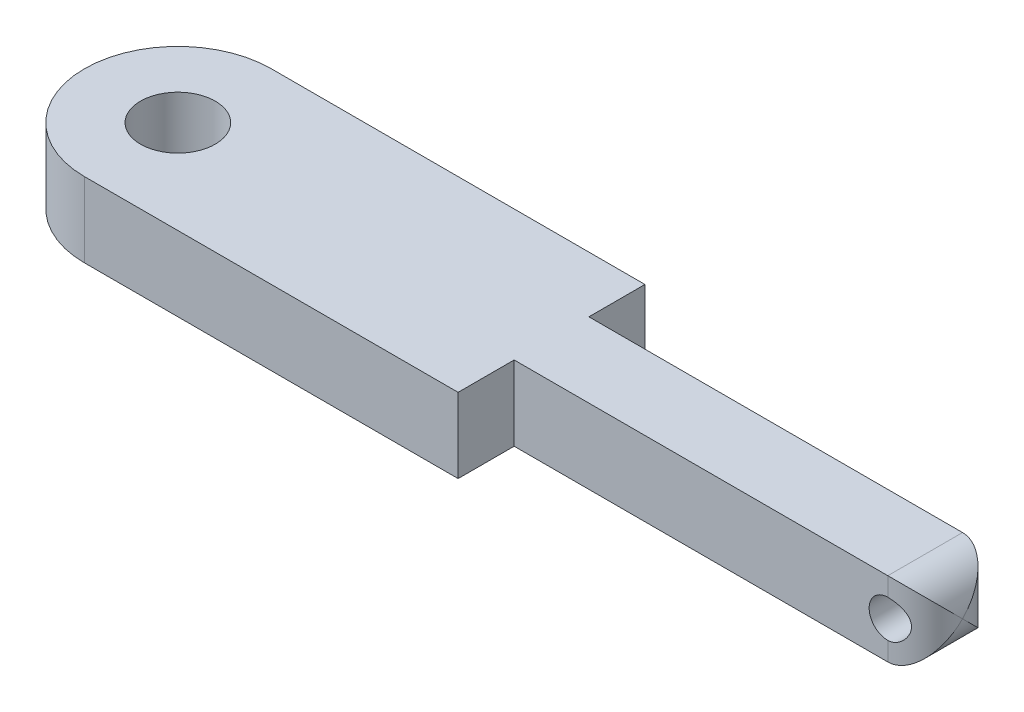
ISO-10303-21;
HEADER;
FILE_DESCRIPTION(('STEP AP214'),'2;1');
FILE_NAME('part.step','',(''),(''),'','','');
FILE_SCHEMA(('AUTOMOTIVE_DESIGN { 1 0 10303 214 1 1 1 1 }'));
ENDSEC;
DATA;
#1=APPLICATION_CONTEXT('core data for automotive mechanical design processes');
#2=APPLICATION_PROTOCOL_DEFINITION('international standard','automotive_design',2000,#1);
#3=PRODUCT_CONTEXT('',#1,'mechanical');
#4=PRODUCT('Part','Part','',(#3));
#5=PRODUCT_RELATED_PRODUCT_CATEGORY('part','',(#4));
#6=PRODUCT_DEFINITION_FORMATION('','',#4);
#7=PRODUCT_DEFINITION_CONTEXT('part definition',#1,'design');
#8=PRODUCT_DEFINITION('design','',#6,#7);
#9=PRODUCT_DEFINITION_SHAPE('','',#8);
#10=(LENGTH_UNIT() NAMED_UNIT(*) SI_UNIT(.MILLI.,.METRE.));
#11=(NAMED_UNIT(*) PLANE_ANGLE_UNIT() SI_UNIT($,.RADIAN.));
#12=(NAMED_UNIT(*) SI_UNIT($,.STERADIAN.) SOLID_ANGLE_UNIT());
#13=UNCERTAINTY_MEASURE_WITH_UNIT(LENGTH_MEASURE(1.E-05),#10,'distance_accuracy_value','');
#14=(GEOMETRIC_REPRESENTATION_CONTEXT(3) GLOBAL_UNCERTAINTY_ASSIGNED_CONTEXT((#13)) GLOBAL_UNIT_ASSIGNED_CONTEXT((#10,
#11,#12)) REPRESENTATION_CONTEXT('',''));
#15=CARTESIAN_POINT('',(0.,0.,0.));
#16=DIRECTION('',(0.,0.,1.));
#17=DIRECTION('',(1.,0.,0.));
#18=AXIS2_PLACEMENT_3D('',#15,#16,#17);
#19=CARTESIAN_POINT('',(10.,0.,0.));
#20=DIRECTION('',(0.,1.,0.));
#21=DIRECTION('',(0.,0.,1.));
#22=AXIS2_PLACEMENT_3D('',#19,#20,#21);
#23=CYLINDRICAL_SURFACE('',#22,1.);
#24=DIRECTION('',(0.,1.,0.));
#25=VECTOR('',#24,1.);
#26=CARTESIAN_POINT('',(10.,0.,-1.));
#27=LINE('',#26,#25);
#28=CARTESIAN_POINT('',(10.,0.,-1.));
#29=VERTEX_POINT('',#28);
#30=CARTESIAN_POINT('',(10.,0.499999999999999,-1.));
#31=VERTEX_POINT('',#30);
#32=EDGE_CURVE('E137',#29,#31,#27,.T.);
#33=ORIENTED_EDGE('',*,*,#32,.T.);
#34=CARTESIAN_POINT('',(10.,0.499999999999999,-1.));
#35=CARTESIAN_POINT('',(10.0264109436122,0.499969278646028,-1.00003489347554));
#36=CARTESIAN_POINT('',(10.052786216714,0.502090198402809,-0.998955179933705));
#37=CARTESIAN_POINT('',(10.1046170590602,0.510375344678821,-0.994841298896768));
#38=CARTESIAN_POINT('',(10.1300763145599,0.516520844722159,-0.99181618457059));
#39=CARTESIAN_POINT('',(10.1794560065244,0.532590236268932,-0.984086072426958));
#40=CARTESIAN_POINT('',(10.2033781664755,0.542509806479023,-0.979382996250282));
#41=CARTESIAN_POINT('',(10.2492118588335,0.565771476653636,-0.968734626101912));
#42=CARTESIAN_POINT('',(10.2711213519603,0.579116997047639,-0.962788091782536));
#43=CARTESIAN_POINT('',(10.3137552767197,0.609759273924516,-0.949781142113348));
#44=CARTESIAN_POINT('',(10.3343298069632,0.627245013574984,-0.942675309454626));
#45=CARTESIAN_POINT('',(10.3723914797384,0.665262920256701,-0.92829904239433));
#46=CARTESIAN_POINT('',(10.3898765929843,0.685797073467811,-0.921028503315962));
#47=CARTESIAN_POINT('',(10.4226262191922,0.731241940379166,-0.906494682588945));
#48=CARTESIAN_POINT('',(10.4376130301563,0.756368645666281,-0.899275766793425));
#49=CARTESIAN_POINT('',(10.4630843600092,0.809184333831799,-0.886429754665851));
#50=CARTESIAN_POINT('',(10.4735722016973,0.836871407265734,-0.880801484583976));
#51=CARTESIAN_POINT('',(10.4890661368589,0.892332245864772,-0.872289383056603));
#52=CARTESIAN_POINT('',(10.4943628088972,0.920001595609081,-0.869261426378289));
#53=CARTESIAN_POINT('',(10.5002134829302,0.975988774463041,-0.865909457745175));
#54=CARTESIAN_POINT('',(10.5007720644617,1.00430595086791,-0.865582834860694));
#55=CARTESIAN_POINT('',(10.4973436265784,1.05714328052156,-0.86755466123951));
#56=CARTESIAN_POINT('',(10.4938922056216,1.08171254841555,-0.869543861679792));
#57=CARTESIAN_POINT('',(10.4834697725099,1.12986146662372,-0.875381226954478));
#58=CARTESIAN_POINT('',(10.4764977152904,1.15344082083986,-0.879229943752459));
#59=CARTESIAN_POINT('',(10.4591050153264,1.19961424269755,-0.888437317432712));
#60=CARTESIAN_POINT('',(10.4486078372095,1.22217257325342,-0.89382905302402));
#61=CARTESIAN_POINT('',(10.4245212064231,1.2653165791887,-0.905516848396164));
#62=CARTESIAN_POINT('',(10.4109302797226,1.28590130757024,-0.911813338722587));
#63=CARTESIAN_POINT('',(10.3790336032019,1.32725994248255,-0.925565560593102));
#64=CARTESIAN_POINT('',(10.3603485996033,1.34772713862001,-0.933067070737564));
#65=CARTESIAN_POINT('',(10.3197789256663,1.38536668184063,-0.947737690917046));
#66=CARTESIAN_POINT('',(10.2978925389202,1.40253724995868,-0.954906619907227));
#67=CARTESIAN_POINT('',(10.2502467630778,1.43385080540682,-0.968513390794041));
#68=CARTESIAN_POINT('',(10.2243538078332,1.44781386783331,-0.974901126588278));
#69=CARTESIAN_POINT('',(10.1702010284742,1.47105853510722,-0.985794285525002));
#70=CARTESIAN_POINT('',(10.1419455672184,1.48034855635226,-0.990303090191398));
#71=CARTESIAN_POINT('',(10.0945508034102,1.49134368741379,-0.99569316261751));
#72=CARTESIAN_POINT('',(10.0758359223299,1.49457874017518,-0.99729742407765));
#73=CARTESIAN_POINT('',(10.0380862304126,1.49891094061456,-0.999455377378267));
#74=CARTESIAN_POINT('',(10.0190511723547,1.50000635182835,-1.00000821590818));
#75=CARTESIAN_POINT('',(10.,1.5,-1.));
#76=B_SPLINE_CURVE_WITH_KNOTS('',3,(#34,#35,#36,#37,#38,#39,#40,#41,#42,#43,#44,#45,#46,#47,#48,
#49,#50,#51,#52,#53,#54,#55,#56,#57,#58,#59,#60,#61,#62,#63,#64,#65,#66,#67,#68,#69,#70,#71,#72,
#73,#74,#75),.UNSPECIFIED.,.F.,.F.,(4,2,2,2,2,2,2,2,2,2,2,2,2,2,2,2,2,2,2,2,4),(0.,
0.0790696798558918,0.157774035821077,0.236388545538948,0.315081850421875,0.39849517559633,
0.481963088819586,0.571909672670744,0.661789709902211,0.746289073897586,0.830706756868567,
0.905029335830032,0.979373989662274,1.05545012161112,1.13156257654031,1.21732203515647,
1.30312764301931,1.39296054548354,1.48263106952233,1.53966960678405,1.59675441548445),.UNSPECIFIED.);
#77=CARTESIAN_POINT('',(10.,1.5,-1.));
#78=VERTEX_POINT('',#77);
#79=EDGE_CURVE('E63',#31,#78,#76,.T.);
#80=ORIENTED_EDGE('',*,*,#79,.T.);
#81=CARTESIAN_POINT('',(10.,2.,-1.));
#82=VERTEX_POINT('',#81);
#83=EDGE_CURVE('E134',#78,#82,#27,.T.);
#84=ORIENTED_EDGE('',*,*,#83,.T.);
#85=CARTESIAN_POINT('',(10.,1.,0.));
#86=DIRECTION('',(0.,0.707106781186547,0.707106781186548));
#87=DIRECTION('',(0.,0.707106781186548,-0.707106781186547));
#88=AXIS2_PLACEMENT_3D('',#85,#86,#87);
#89=ELLIPSE('',#88,1.4142135623731,1.);
#90=CARTESIAN_POINT('',(11.,1.,0.));
#91=VERTEX_POINT('',#90);
#92=EDGE_CURVE('E204',#82,#91,#89,.F.);
#93=ORIENTED_EDGE('',*,*,#92,.T.);
#94=CARTESIAN_POINT('',(10.,1.,0.));
#95=DIRECTION('',(0.,0.707106781186548,-0.707106781186547));
#96=DIRECTION('',(0.,0.707106781186547,0.707106781186548));
#97=AXIS2_PLACEMENT_3D('',#94,#95,#96);
#98=ELLIPSE('',#97,1.41421356237309,1.);
#99=EDGE_CURVE('E209',#91,#29,#98,.T.);
#100=ORIENTED_EDGE('',*,*,#99,.T.);
#101=EDGE_LOOP('',(#33,#80,#84,#93,#100));
#102=FACE_BOUND('',#101,.T.);
#103=ADVANCED_FACE('F43',(#102),#23,.T.);
#104=CARTESIAN_POINT('',(0.,2.,-2.5));
#105=DIRECTION('',(-1.,0.,0.));
#106=DIRECTION('',(0.,0.,1.));
#107=AXIS2_PLACEMENT_3D('',#104,#105,#106);
#108=PLANE('',#107);
#109=DIRECTION('',(0.,1.,0.));
#110=VECTOR('',#109,1.);
#111=CARTESIAN_POINT('',(0.,2.,-1.));
#112=LINE('',#111,#110);
#113=CARTESIAN_POINT('',(0.,0.,-1.));
#114=VERTEX_POINT('',#113);
#115=CARTESIAN_POINT('',(0.,2.,-1.));
#116=VERTEX_POINT('',#115);
#117=EDGE_CURVE('E146',#114,#116,#112,.T.);
#118=ORIENTED_EDGE('',*,*,#117,.F.);
#119=DIRECTION('',(0.,0.,-1.));
#120=VECTOR('',#119,1.);
#121=CARTESIAN_POINT('',(0.,0.,-2.5));
#122=LINE('',#121,#120);
#123=CARTESIAN_POINT('',(0.,0.,-2.5));
#124=VERTEX_POINT('',#123);
#125=EDGE_CURVE('E188',#114,#124,#122,.T.);
#126=ORIENTED_EDGE('',*,*,#125,.T.);
#127=DIRECTION('',(0.,-1.,0.));
#128=VECTOR('',#127,1.);
#129=CARTESIAN_POINT('',(0.,2.,-2.5));
#130=LINE('',#129,#128);
#131=CARTESIAN_POINT('',(0.,2.,-2.5));
#132=VERTEX_POINT('',#131);
#133=EDGE_CURVE('E195',#132,#124,#130,.T.);
#134=ORIENTED_EDGE('',*,*,#133,.F.);
#135=DIRECTION('',(0.,0.,-1.));
#136=VECTOR('',#135,1.);
#137=CARTESIAN_POINT('',(0.,2.,-2.5));
#138=LINE('',#137,#136);
#139=EDGE_CURVE('E177',#116,#132,#138,.T.);
#140=ORIENTED_EDGE('',*,*,#139,.F.);
#141=EDGE_LOOP('',(#118,#126,#134,#140));
#142=FACE_BOUND('',#141,.T.);
#143=ADVANCED_FACE('F249',(#142),#108,.F.);
#144=DIRECTION('',(0.,-1.,0.));
#145=VECTOR('',#144,1.);
#146=CARTESIAN_POINT('',(0.,2.,1.));
#147=LINE('',#146,#145);
#148=CARTESIAN_POINT('',(0.,2.,1.));
#149=VERTEX_POINT('',#148);
#150=CARTESIAN_POINT('',(0.,0.,1.));
#151=VERTEX_POINT('',#150);
#152=EDGE_CURVE('E154',#149,#151,#147,.T.);
#153=ORIENTED_EDGE('',*,*,#152,.F.);
#154=CARTESIAN_POINT('',(0.,2.,2.5));
#155=VERTEX_POINT('',#154);
#156=EDGE_CURVE('E178',#155,#149,#138,.T.);
#157=ORIENTED_EDGE('',*,*,#156,.F.);
#158=DIRECTION('',(0.,-1.,0.));
#159=VECTOR('',#158,1.);
#160=CARTESIAN_POINT('',(0.,2.,2.5));
#161=LINE('',#160,#159);
#162=CARTESIAN_POINT('',(0.,0.,2.5));
#163=VERTEX_POINT('',#162);
#164=EDGE_CURVE('E198',#155,#163,#161,.T.);
#165=ORIENTED_EDGE('',*,*,#164,.T.);
#166=EDGE_CURVE('E189',#163,#151,#122,.T.);
#167=ORIENTED_EDGE('',*,*,#166,.T.);
#168=EDGE_LOOP('',(#153,#157,#165,#167));
#169=FACE_BOUND('',#168,.T.);
#170=ADVANCED_FACE('F229',(#169),#108,.F.);
#171=CARTESIAN_POINT('',(-10.,2.,0.));
#172=DIRECTION('',(0.,1.,0.));
#173=DIRECTION('',(0.,0.,1.));
#174=AXIS2_PLACEMENT_3D('',#171,#172,#173);
#175=PLANE('',#174);
#176=DIRECTION('',(0.,0.,-1.));
#177=VECTOR('',#176,1.);
#178=CARTESIAN_POINT('',(10.,2.,2.5));
#179=LINE('',#178,#177);
#180=CARTESIAN_POINT('',(10.,2.,1.));
#181=VERTEX_POINT('',#180);
#182=EDGE_CURVE('E138',#181,#82,#179,.T.);
#183=ORIENTED_EDGE('',*,*,#182,.T.);
#184=DIRECTION('',(-1.,0.,0.));
#185=VECTOR('',#184,1.);
#186=CARTESIAN_POINT('',(11.,2.,-1.));
#187=LINE('',#186,#185);
#188=EDGE_CURVE('E143',#82,#116,#187,.T.);
#189=ORIENTED_EDGE('',*,*,#188,.T.);
#190=ORIENTED_EDGE('',*,*,#139,.T.);
#191=DIRECTION('',(-1.,0.,0.));
#192=VECTOR('',#191,1.);
#193=CARTESIAN_POINT('',(-10.,2.,-2.5));
#194=LINE('',#193,#192);
#195=CARTESIAN_POINT('',(-10.,2.,-2.5));
#196=VERTEX_POINT('',#195);
#197=EDGE_CURVE('E181',#132,#196,#194,.T.);
#198=ORIENTED_EDGE('',*,*,#197,.T.);
#199=CARTESIAN_POINT('',(-10.,2.,0.));
#200=DIRECTION('',(0.,1.,0.));
#201=DIRECTION('',(0.,0.,1.));
#202=AXIS2_PLACEMENT_3D('',#199,#200,#201);
#203=CIRCLE('',#202,2.5);
#204=CARTESIAN_POINT('',(-10.,2.,2.5));
#205=VERTEX_POINT('',#204);
#206=EDGE_CURVE('E171',#196,#205,#203,.T.);
#207=ORIENTED_EDGE('',*,*,#206,.T.);
#208=DIRECTION('',(1.,0.,0.));
#209=VECTOR('',#208,1.);
#210=CARTESIAN_POINT('',(-10.,2.,2.5));
#211=LINE('',#210,#209);
#212=EDGE_CURVE('E174',#205,#155,#211,.T.);
#213=ORIENTED_EDGE('',*,*,#212,.T.);
#214=ORIENTED_EDGE('',*,*,#156,.T.);
#215=DIRECTION('',(-1.,0.,0.));
#216=VECTOR('',#215,1.);
#217=CARTESIAN_POINT('',(11.,2.,1.));
#218=LINE('',#217,#216);
#219=EDGE_CURVE('E161',#181,#149,#218,.T.);
#220=ORIENTED_EDGE('',*,*,#219,.F.);
#221=EDGE_LOOP('',(#183,#189,#190,#198,#207,#213,#214,#220));
#222=FACE_BOUND('',#221,.T.);
#223=CARTESIAN_POINT('',(-10.,2.,0.));
#224=DIRECTION('',(0.,1.,0.));
#225=DIRECTION('',(0.,0.,1.));
#226=AXIS2_PLACEMENT_3D('',#223,#224,#225);
#227=CIRCLE('',#226,1.);
#228=CARTESIAN_POINT('',(-10.,2.,1.));
#229=VERTEX_POINT('',#228);
#230=EDGE_CURVE('E165',#229,#229,#227,.T.);
#231=ORIENTED_EDGE('',*,*,#230,.F.);
#232=EDGE_LOOP('',(#231));
#233=FACE_BOUND('',#232,.T.);
#234=ADVANCED_FACE('F221',(#222,#233),#175,.T.);
#235=CARTESIAN_POINT('',(-10.,0.,0.));
#236=DIRECTION('',(0.,1.,0.));
#237=DIRECTION('',(0.,0.,1.));
#238=AXIS2_PLACEMENT_3D('',#235,#236,#237);
#239=PLANE('',#238);
#240=DIRECTION('',(-1.,0.,0.));
#241=VECTOR('',#240,1.);
#242=CARTESIAN_POINT('',(11.,0.,-1.));
#243=LINE('',#242,#241);
#244=EDGE_CURVE('E157',#29,#114,#243,.T.);
#245=ORIENTED_EDGE('',*,*,#244,.F.);
#246=DIRECTION('',(0.,0.,-1.));
#247=VECTOR('',#246,1.);
#248=CARTESIAN_POINT('',(10.,0.,2.5));
#249=LINE('',#248,#247);
#250=CARTESIAN_POINT('',(10.,0.,1.));
#251=VERTEX_POINT('',#250);
#252=EDGE_CURVE('E238',#251,#29,#249,.T.);
#253=ORIENTED_EDGE('',*,*,#252,.F.);
#254=DIRECTION('',(-1.,0.,0.));
#255=VECTOR('',#254,1.);
#256=CARTESIAN_POINT('',(11.,0.,1.));
#257=LINE('',#256,#255);
#258=EDGE_CURVE('E159',#251,#151,#257,.T.);
#259=ORIENTED_EDGE('',*,*,#258,.T.);
#260=ORIENTED_EDGE('',*,*,#166,.F.);
#261=DIRECTION('',(1.,0.,0.));
#262=VECTOR('',#261,1.);
#263=CARTESIAN_POINT('',(-10.,0.,2.5));
#264=LINE('',#263,#262);
#265=CARTESIAN_POINT('',(-10.,0.,2.5));
#266=VERTEX_POINT('',#265);
#267=EDGE_CURVE('E186',#266,#163,#264,.T.);
#268=ORIENTED_EDGE('',*,*,#267,.F.);
#269=CARTESIAN_POINT('',(-10.,0.,0.));
#270=DIRECTION('',(0.,1.,0.));
#271=DIRECTION('',(0.,0.,1.));
#272=AXIS2_PLACEMENT_3D('',#269,#270,#271);
#273=CIRCLE('',#272,2.5);
#274=CARTESIAN_POINT('',(-10.,0.,-2.5));
#275=VERTEX_POINT('',#274);
#276=EDGE_CURVE('E168',#275,#266,#273,.T.);
#277=ORIENTED_EDGE('',*,*,#276,.F.);
#278=DIRECTION('',(-1.,0.,0.));
#279=VECTOR('',#278,1.);
#280=CARTESIAN_POINT('',(-10.,0.,-2.5));
#281=LINE('',#280,#279);
#282=EDGE_CURVE('E175',#124,#275,#281,.T.);
#283=ORIENTED_EDGE('',*,*,#282,.F.);
#284=ORIENTED_EDGE('',*,*,#125,.F.);
#285=EDGE_LOOP('',(#245,#253,#259,#260,#268,#277,#283,#284));
#286=FACE_BOUND('',#285,.T.);
#287=CARTESIAN_POINT('',(-10.,0.,0.));
#288=DIRECTION('',(0.,1.,0.));
#289=DIRECTION('',(0.,0.,1.));
#290=AXIS2_PLACEMENT_3D('',#287,#288,#289);
#291=CIRCLE('',#290,1.);
#292=CARTESIAN_POINT('',(-10.,0.,1.));
#293=VERTEX_POINT('',#292);
#294=EDGE_CURVE('E164',#293,#293,#291,.T.);
#295=ORIENTED_EDGE('',*,*,#294,.T.);
#296=EDGE_LOOP('',(#295));
#297=FACE_BOUND('',#296,.T.);
#298=ADVANCED_FACE('F234',(#286,#297),#239,.F.);
#299=CARTESIAN_POINT('',(-10.,2.,0.));
#300=DIRECTION('',(0.,-1.,0.));
#301=DIRECTION('',(0.,0.,-1.));
#302=AXIS2_PLACEMENT_3D('',#299,#300,#301);
#303=CYLINDRICAL_SURFACE('',#302,2.5);
#304=ORIENTED_EDGE('',*,*,#276,.T.);
#305=DIRECTION('',(0.,-1.,0.));
#306=VECTOR('',#305,1.);
#307=CARTESIAN_POINT('',(-10.,2.,2.5));
#308=LINE('',#307,#306);
#309=EDGE_CURVE('E201',#205,#266,#308,.T.);
#310=ORIENTED_EDGE('',*,*,#309,.F.);
#311=ORIENTED_EDGE('',*,*,#206,.F.);
#312=DIRECTION('',(0.,-1.,0.));
#313=VECTOR('',#312,1.);
#314=CARTESIAN_POINT('',(-10.,2.,-2.5));
#315=LINE('',#314,#313);
#316=EDGE_CURVE('E183',#196,#275,#315,.T.);
#317=ORIENTED_EDGE('',*,*,#316,.T.);
#318=EDGE_LOOP('',(#304,#310,#311,#317));
#319=FACE_BOUND('',#318,.T.);
#320=ADVANCED_FACE('F45',(#319),#303,.T.);
#321=CARTESIAN_POINT('',(-10.,2.,2.5));
#322=DIRECTION('',(0.,0.,-1.));
#323=DIRECTION('',(-1.,0.,0.));
#324=AXIS2_PLACEMENT_3D('',#321,#322,#323);
#325=PLANE('',#324);
#326=ORIENTED_EDGE('',*,*,#267,.T.);
#327=ORIENTED_EDGE('',*,*,#164,.F.);
#328=ORIENTED_EDGE('',*,*,#212,.F.);
#329=ORIENTED_EDGE('',*,*,#309,.T.);
#330=EDGE_LOOP('',(#326,#327,#328,#329));
#331=FACE_BOUND('',#330,.T.);
#332=ADVANCED_FACE('F277',(#331),#325,.F.);
#333=CARTESIAN_POINT('',(-10.,2.,-2.5));
#334=DIRECTION('',(0.,0.,1.));
#335=DIRECTION('',(1.,0.,0.));
#336=AXIS2_PLACEMENT_3D('',#333,#334,#335);
#337=PLANE('',#336);
#338=ORIENTED_EDGE('',*,*,#282,.T.);
#339=ORIENTED_EDGE('',*,*,#316,.F.);
#340=ORIENTED_EDGE('',*,*,#197,.F.);
#341=ORIENTED_EDGE('',*,*,#133,.T.);
#342=EDGE_LOOP('',(#338,#339,#340,#341));
#343=FACE_BOUND('',#342,.T.);
#344=ADVANCED_FACE('F270',(#343),#337,.F.);
#345=CARTESIAN_POINT('',(-10.,2.,0.));
#346=DIRECTION('',(0.,-1.,0.));
#347=DIRECTION('',(0.,0.,-1.));
#348=AXIS2_PLACEMENT_3D('',#345,#346,#347);
#349=CYLINDRICAL_SURFACE('',#348,1.);
#350=ORIENTED_EDGE('',*,*,#230,.T.);
#351=EDGE_LOOP('',(#350));
#352=FACE_BOUND('',#351,.T.);
#353=ORIENTED_EDGE('',*,*,#294,.F.);
#354=EDGE_LOOP('',(#353));
#355=FACE_BOUND('',#354,.T.);
#356=ADVANCED_FACE('F265',(#352,#355),#349,.F.);
#357=CARTESIAN_POINT('',(11.,2.,-1.));
#358=DIRECTION('',(0.,0.,1.));
#359=DIRECTION('',(0.,-1.,0.));
#360=AXIS2_PLACEMENT_3D('',#357,#358,#359);
#361=PLANE('',#360);
#362=ORIENTED_EDGE('',*,*,#83,.F.);
#363=CARTESIAN_POINT('',(10.,1.,-1.));
#364=DIRECTION('',(0.,0.,-1.));
#365=DIRECTION('',(0.,1.,0.));
#366=AXIS2_PLACEMENT_3D('',#363,#364,#365);
#367=CIRCLE('',#366,0.500000000000001);
#368=EDGE_CURVE('E125',#31,#78,#367,.T.);
#369=ORIENTED_EDGE('',*,*,#368,.F.);
#370=ORIENTED_EDGE('',*,*,#32,.F.);
#371=ORIENTED_EDGE('',*,*,#244,.T.);
#372=ORIENTED_EDGE('',*,*,#117,.T.);
#373=ORIENTED_EDGE('',*,*,#188,.F.);
#374=EDGE_LOOP('',(#362,#369,#370,#371,#372,#373));
#375=FACE_BOUND('',#374,.T.);
#376=ADVANCED_FACE('F141',(#375),#361,.F.);
#377=CARTESIAN_POINT('',(11.,2.,1.));
#378=DIRECTION('',(0.,0.,-1.));
#379=DIRECTION('',(0.,1.,0.));
#380=AXIS2_PLACEMENT_3D('',#377,#378,#379);
#381=PLANE('',#380);
#382=DIRECTION('',(0.,1.,0.));
#383=VECTOR('',#382,1.);
#384=CARTESIAN_POINT('',(10.,0.,1.));
#385=LINE('',#384,#383);
#386=CARTESIAN_POINT('',(10.,0.499999999999999,1.));
#387=VERTEX_POINT('',#386);
#388=EDGE_CURVE('E144',#251,#387,#385,.T.);
#389=ORIENTED_EDGE('',*,*,#388,.T.);
#390=CARTESIAN_POINT('',(10.,1.,1.));
#391=DIRECTION('',(0.,0.,-1.));
#392=DIRECTION('',(0.,1.,0.));
#393=AXIS2_PLACEMENT_3D('',#390,#391,#392);
#394=CIRCLE('',#393,0.500000000000001);
#395=CARTESIAN_POINT('',(10.,1.5,1.));
#396=VERTEX_POINT('',#395);
#397=EDGE_CURVE('E70',#387,#396,#394,.T.);
#398=ORIENTED_EDGE('',*,*,#397,.T.);
#399=EDGE_CURVE('E148',#396,#181,#385,.T.);
#400=ORIENTED_EDGE('',*,*,#399,.T.);
#401=ORIENTED_EDGE('',*,*,#219,.T.);
#402=ORIENTED_EDGE('',*,*,#152,.T.);
#403=ORIENTED_EDGE('',*,*,#258,.F.);
#404=EDGE_LOOP('',(#389,#398,#400,#401,#402,#403));
#405=FACE_BOUND('',#404,.T.);
#406=ADVANCED_FACE('F226',(#405),#381,.F.);
#407=ORIENTED_EDGE('',*,*,#399,.F.);
#408=CARTESIAN_POINT('',(10.,1.5,1.));
#409=CARTESIAN_POINT('',(10.0264109436122,1.50003072135397,1.00003489347554));
#410=CARTESIAN_POINT('',(10.052786216714,1.49790980159719,0.998955179933705));
#411=CARTESIAN_POINT('',(10.1046170590602,1.48962465532118,0.994841298896768));
#412=CARTESIAN_POINT('',(10.1300763145599,1.48347915527784,0.99181618457059));
#413=CARTESIAN_POINT('',(10.1794560065244,1.46740976373107,0.984086072426958));
#414=CARTESIAN_POINT('',(10.2033781664755,1.45749019352098,0.979382996250282));
#415=CARTESIAN_POINT('',(10.2492118588335,1.43422852334636,0.968734626101912));
#416=CARTESIAN_POINT('',(10.2711213519603,1.42088300295236,0.962788091782536));
#417=CARTESIAN_POINT('',(10.3137552767197,1.39024072607548,0.949781142113348));
#418=CARTESIAN_POINT('',(10.3343298069632,1.37275498642502,0.942675309454626));
#419=CARTESIAN_POINT('',(10.3723914797384,1.3347370797433,0.92829904239433));
#420=CARTESIAN_POINT('',(10.3898765929843,1.31420292653219,0.921028503315962));
#421=CARTESIAN_POINT('',(10.4226262191922,1.26875805962083,0.906494682588945));
#422=CARTESIAN_POINT('',(10.4376130301563,1.24363135433372,0.899275766793425));
#423=CARTESIAN_POINT('',(10.4630843600092,1.1908156661682,0.886429754665851));
#424=CARTESIAN_POINT('',(10.4735722016973,1.16312859273427,0.880801484583976));
#425=CARTESIAN_POINT('',(10.4890661368589,1.10766775413523,0.872289383056604));
#426=CARTESIAN_POINT('',(10.4943628088972,1.07999840439092,0.869261426378289));
#427=CARTESIAN_POINT('',(10.5002134829302,1.02401122553696,0.865909457745175));
#428=CARTESIAN_POINT('',(10.5007720644617,0.995694049132091,0.865582834860694));
#429=CARTESIAN_POINT('',(10.4973436265784,0.942856719478439,0.86755466123951));
#430=CARTESIAN_POINT('',(10.4938922056216,0.918287451584446,0.869543861679792));
#431=CARTESIAN_POINT('',(10.4834697725099,0.870138533376276,0.875381226954478));
#432=CARTESIAN_POINT('',(10.4764977152904,0.846559179160137,0.879229943752459));
#433=CARTESIAN_POINT('',(10.4591050153264,0.800385757302446,0.888437317432712));
#434=CARTESIAN_POINT('',(10.4486078372095,0.777827426746579,0.89382905302402));
#435=CARTESIAN_POINT('',(10.4245212064231,0.734683420811297,0.905516848396164));
#436=CARTESIAN_POINT('',(10.4109302797226,0.71409869242976,0.911813338722587));
#437=CARTESIAN_POINT('',(10.3790336032019,0.67274005751745,0.925565560593102));
#438=CARTESIAN_POINT('',(10.3603485996033,0.652272861379986,0.933067070737564));
#439=CARTESIAN_POINT('',(10.3197789256663,0.614633318159366,0.947737690917046));
#440=CARTESIAN_POINT('',(10.2978925389202,0.597462750041321,0.954906619907227));
#441=CARTESIAN_POINT('',(10.2502467630778,0.566149194593177,0.968513390794041));
#442=CARTESIAN_POINT('',(10.2243538078332,0.552186132166686,0.974901126588278));
#443=CARTESIAN_POINT('',(10.1702010284742,0.528941464892784,0.985794285525002));
#444=CARTESIAN_POINT('',(10.1419455672184,0.519651443647738,0.990303090191398));
#445=CARTESIAN_POINT('',(10.0945508034102,0.508656312586206,0.99569316261751));
#446=CARTESIAN_POINT('',(10.0758359223299,0.50542125982482,0.99729742407765));
#447=CARTESIAN_POINT('',(10.0380862304126,0.501089059385443,0.999455377378267));
#448=CARTESIAN_POINT('',(10.0190511723547,0.499993648171646,1.00000821590818));
#449=CARTESIAN_POINT('',(10.,0.499999999999999,1.));
#450=B_SPLINE_CURVE_WITH_KNOTS('',3,(#408,#409,#410,#411,#412,#413,#414,#415,#416,#417,#418,
#419,#420,#421,#422,#423,#424,#425,#426,#427,#428,#429,#430,#431,#432,#433,#434,#435,#436,#437,
#438,#439,#440,#441,#442,#443,#444,#445,#446,#447,#448,#449),.UNSPECIFIED.,.F.,.F.,(4,2,2,2,2,2,
2,2,2,2,2,2,2,2,2,2,2,2,2,2,4),(0.,0.0790696798558918,0.157774035821077,0.236388545538948,
0.315081850421875,0.39849517559633,0.481963088819586,0.571909672670743,0.661789709902211,
0.746289073897586,0.830706756868567,0.905029335830033,0.979373989662274,1.05545012161112,
1.13156257654031,1.21732203515647,1.30312764301931,1.39296054548354,1.48263106952233,
1.53966960678405,1.59675441548445),.UNSPECIFIED.);
#451=EDGE_CURVE('E11',#396,#387,#450,.T.);
#452=ORIENTED_EDGE('',*,*,#451,.T.);
#453=ORIENTED_EDGE('',*,*,#388,.F.);
#454=CARTESIAN_POINT('',(10.,1.,0.));
#455=DIRECTION('',(0.,0.707106781186547,0.707106781186548));
#456=DIRECTION('',(0.,0.707106781186548,-0.707106781186547));
#457=AXIS2_PLACEMENT_3D('',#454,#455,#456);
#458=ELLIPSE('',#457,1.4142135623731,1.);
#459=EDGE_CURVE('E206',#251,#91,#458,.T.);
#460=ORIENTED_EDGE('',*,*,#459,.T.);
#461=CARTESIAN_POINT('',(10.,1.,0.));
#462=DIRECTION('',(0.,0.707106781186548,-0.707106781186547));
#463=DIRECTION('',(0.,0.707106781186547,0.707106781186548));
#464=AXIS2_PLACEMENT_3D('',#461,#462,#463);
#465=ELLIPSE('',#464,1.41421356237309,1.);
#466=EDGE_CURVE('E57',#91,#181,#465,.F.);
#467=ORIENTED_EDGE('',*,*,#466,.T.);
#468=EDGE_LOOP('',(#407,#452,#453,#460,#467));
#469=FACE_BOUND('',#468,.T.);
#470=ADVANCED_FACE('F215',(#469),#23,.T.);
#471=CARTESIAN_POINT('',(10.,0.999999999999999,2.5));
#472=DIRECTION('',(0.,0.,-1.));
#473=DIRECTION('',(0.,1.,0.));
#474=AXIS2_PLACEMENT_3D('',#471,#472,#473);
#475=CYLINDRICAL_SURFACE('',#474,1.);
#476=ORIENTED_EDGE('',*,*,#92,.F.);
#477=ORIENTED_EDGE('',*,*,#182,.F.);
#478=ORIENTED_EDGE('',*,*,#466,.F.);
#479=EDGE_LOOP('',(#476,#477,#478));
#480=FACE_BOUND('',#479,.T.);
#481=ADVANCED_FACE('F244',(#480),#475,.T.);
#482=ORIENTED_EDGE('',*,*,#459,.F.);
#483=ORIENTED_EDGE('',*,*,#252,.T.);
#484=ORIENTED_EDGE('',*,*,#99,.F.);
#485=EDGE_LOOP('',(#482,#483,#484));
#486=FACE_BOUND('',#485,.T.);
#487=ADVANCED_FACE('F240',(#486),#475,.T.);
#488=CARTESIAN_POINT('',(10.,0.999999999999999,2.5));
#489=DIRECTION('',(0.,0.,-1.));
#490=DIRECTION('',(0.,1.,0.));
#491=AXIS2_PLACEMENT_3D('',#488,#489,#490);
#492=CYLINDRICAL_SURFACE('',#491,0.500000000000001);
#493=ORIENTED_EDGE('',*,*,#451,.F.);
#494=ORIENTED_EDGE('',*,*,#397,.F.);
#495=EDGE_LOOP('',(#493,#494));
#496=FACE_BOUND('',#495,.T.);
#497=ORIENTED_EDGE('',*,*,#368,.T.);
#498=ORIENTED_EDGE('',*,*,#79,.F.);
#499=EDGE_LOOP('',(#497,#498));
#500=FACE_BOUND('',#499,.T.);
#501=ADVANCED_FACE('F126',(#496,#500),#492,.F.);
#502=CLOSED_SHELL('',(#103,#143,#170,#234,#298,#320,#332,#344,#356,#376,#406,#470,#481,#487,#501));
#503=MANIFOLD_SOLID_BREP('B2',#502);
#504=ADVANCED_BREP_SHAPE_REPRESENTATION('',(#18,#503),#14);
#505=SHAPE_DEFINITION_REPRESENTATION(#9,#504);
ENDSEC;
END-ISO-10303-21;
